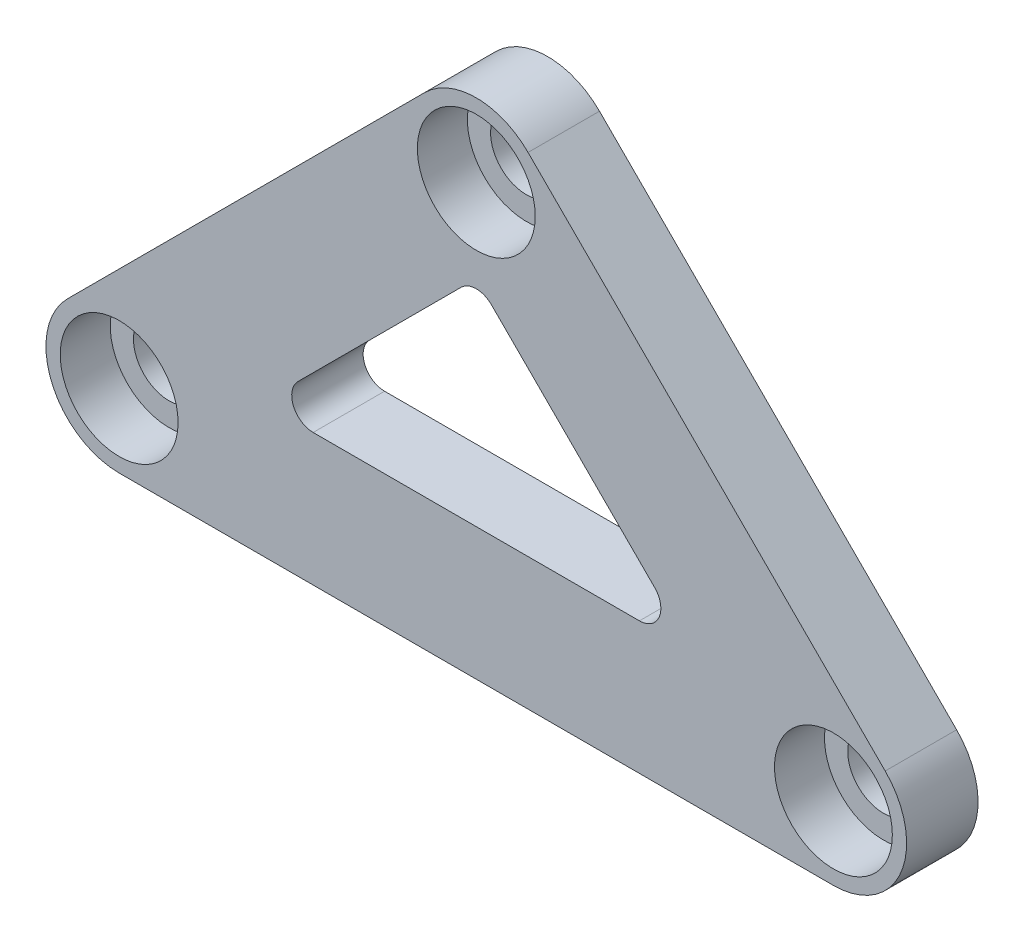
ISO-10303-21;
HEADER;
FILE_DESCRIPTION(('STEP AP214'),'2;1');
FILE_NAME('part.step','',(''),(''),'','','');
FILE_SCHEMA(('AUTOMOTIVE_DESIGN { 1 0 10303 214 1 1 1 1 }'));
ENDSEC;
DATA;
#1=APPLICATION_CONTEXT('core data for automotive mechanical design processes');
#2=APPLICATION_PROTOCOL_DEFINITION('international standard','automotive_design',2000,#1);
#3=PRODUCT_CONTEXT('',#1,'mechanical');
#4=PRODUCT('Part','Part','',(#3));
#5=PRODUCT_RELATED_PRODUCT_CATEGORY('part','',(#4));
#6=PRODUCT_DEFINITION_FORMATION('','',#4);
#7=PRODUCT_DEFINITION_CONTEXT('part definition',#1,'design');
#8=PRODUCT_DEFINITION('design','',#6,#7);
#9=PRODUCT_DEFINITION_SHAPE('','',#8);
#10=(LENGTH_UNIT() NAMED_UNIT(*) SI_UNIT(.MILLI.,.METRE.));
#11=(NAMED_UNIT(*) PLANE_ANGLE_UNIT() SI_UNIT($,.RADIAN.));
#12=(NAMED_UNIT(*) SI_UNIT($,.STERADIAN.) SOLID_ANGLE_UNIT());
#13=UNCERTAINTY_MEASURE_WITH_UNIT(LENGTH_MEASURE(1.E-05),#10,'distance_accuracy_value','');
#14=(GEOMETRIC_REPRESENTATION_CONTEXT(3) GLOBAL_UNCERTAINTY_ASSIGNED_CONTEXT((#13)) GLOBAL_UNIT_ASSIGNED_CONTEXT((#10,
#11,#12)) REPRESENTATION_CONTEXT('',''));
#15=CARTESIAN_POINT('',(0.,0.,0.));
#16=DIRECTION('',(0.,0.,1.));
#17=DIRECTION('',(1.,0.,0.));
#18=AXIS2_PLACEMENT_3D('',#15,#16,#17);
#19=CARTESIAN_POINT('',(0.,-10.25,10.));
#20=DIRECTION('',(0.,1.,0.));
#21=DIRECTION('',(-1.,0.,0.));
#22=AXIS2_PLACEMENT_3D('',#19,#20,#21);
#23=PLANE('',#22);
#24=DIRECTION('',(1.,0.,0.));
#25=VECTOR('',#24,1.);
#26=CARTESIAN_POINT('',(0.,-10.25,0.));
#27=LINE('',#26,#25);
#28=CARTESIAN_POINT('',(0.,-10.25,0.));
#29=VERTEX_POINT('',#28);
#30=CARTESIAN_POINT('',(100.,-10.25,0.));
#31=VERTEX_POINT('',#30);
#32=EDGE_CURVE('E217',#29,#31,#27,.T.);
#33=ORIENTED_EDGE('',*,*,#32,.T.);
#34=DIRECTION('',(0.,0.,-1.));
#35=VECTOR('',#34,1.);
#36=CARTESIAN_POINT('',(100.,-10.25,10.));
#37=LINE('',#36,#35);
#38=CARTESIAN_POINT('',(100.,-10.25,10.));
#39=VERTEX_POINT('',#38);
#40=EDGE_CURVE('E184',#39,#31,#37,.T.);
#41=ORIENTED_EDGE('',*,*,#40,.F.);
#42=DIRECTION('',(1.,0.,0.));
#43=VECTOR('',#42,1.);
#44=CARTESIAN_POINT('',(0.,-10.25,10.));
#45=LINE('',#44,#43);
#46=CARTESIAN_POINT('',(0.,-10.25,10.));
#47=VERTEX_POINT('',#46);
#48=EDGE_CURVE('E189',#47,#39,#45,.T.);
#49=ORIENTED_EDGE('',*,*,#48,.F.);
#50=DIRECTION('',(0.,0.,-1.));
#51=VECTOR('',#50,1.);
#52=CARTESIAN_POINT('',(0.,-10.25,10.));
#53=LINE('',#52,#51);
#54=EDGE_CURVE('E172',#47,#29,#53,.T.);
#55=ORIENTED_EDGE('',*,*,#54,.T.);
#56=EDGE_LOOP('',(#33,#41,#49,#55));
#57=FACE_BOUND('',#56,.T.);
#58=ADVANCED_FACE('F80',(#57),#23,.F.);
#59=CARTESIAN_POINT('',(100.,0.,10.));
#60=DIRECTION('',(0.,0.,-1.));
#61=DIRECTION('',(-1.,0.,0.));
#62=AXIS2_PLACEMENT_3D('',#59,#60,#61);
#63=CYLINDRICAL_SURFACE('',#62,10.25);
#64=CARTESIAN_POINT('',(100.,0.,0.));
#65=DIRECTION('',(0.,0.,1.));
#66=DIRECTION('',(1.,0.,0.));
#67=AXIS2_PLACEMENT_3D('',#64,#65,#66);
#68=CIRCLE('',#67,10.25);
#69=CARTESIAN_POINT('',(107.247844507162,7.24784450716217,0.));
#70=VERTEX_POINT('',#69);
#71=EDGE_CURVE('E208',#31,#70,#68,.T.);
#72=ORIENTED_EDGE('',*,*,#71,.T.);
#73=DIRECTION('',(0.,0.,-1.));
#74=VECTOR('',#73,1.);
#75=CARTESIAN_POINT('',(107.247844507162,7.24784450716217,10.));
#76=LINE('',#75,#74);
#77=CARTESIAN_POINT('',(107.247844507162,7.24784450716217,10.));
#78=VERTEX_POINT('',#77);
#79=EDGE_CURVE('E225',#78,#70,#76,.T.);
#80=ORIENTED_EDGE('',*,*,#79,.F.);
#81=CARTESIAN_POINT('',(100.,0.,10.));
#82=DIRECTION('',(0.,0.,1.));
#83=DIRECTION('',(1.,0.,0.));
#84=AXIS2_PLACEMENT_3D('',#81,#82,#83);
#85=CIRCLE('',#84,10.25);
#86=EDGE_CURVE('E200',#39,#78,#85,.T.);
#87=ORIENTED_EDGE('',*,*,#86,.F.);
#88=ORIENTED_EDGE('',*,*,#40,.T.);
#89=EDGE_LOOP('',(#72,#80,#87,#88));
#90=FACE_BOUND('',#89,.T.);
#91=ADVANCED_FACE('F440',(#90),#63,.T.);
#92=CARTESIAN_POINT('',(57.2478445071616,57.2478445071622,10.));
#93=DIRECTION('',(-0.707106781186544,-0.707106781186551,0.));
#94=DIRECTION('',(0.707106781186551,-0.707106781186544,0.));
#95=AXIS2_PLACEMENT_3D('',#92,#93,#94);
#96=PLANE('',#95);
#97=DIRECTION('',(-0.707106781186551,0.707106781186544,0.));
#98=VECTOR('',#97,1.);
#99=CARTESIAN_POINT('',(57.2478445071616,57.2478445071622,0.));
#100=LINE('',#99,#98);
#101=CARTESIAN_POINT('',(57.2478445071621,57.2478445071616,0.));
#102=VERTEX_POINT('',#101);
#103=EDGE_CURVE('E201',#70,#102,#100,.T.);
#104=ORIENTED_EDGE('',*,*,#103,.T.);
#105=DIRECTION('',(0.,0.,-1.));
#106=VECTOR('',#105,1.);
#107=CARTESIAN_POINT('',(57.2478445071621,57.2478445071616,10.));
#108=LINE('',#107,#106);
#109=CARTESIAN_POINT('',(57.2478445071621,57.2478445071616,10.));
#110=VERTEX_POINT('',#109);
#111=EDGE_CURVE('E216',#110,#102,#108,.T.);
#112=ORIENTED_EDGE('',*,*,#111,.F.);
#113=DIRECTION('',(-0.707106781186551,0.707106781186544,0.));
#114=VECTOR('',#113,1.);
#115=CARTESIAN_POINT('',(57.2478445071616,57.2478445071622,10.));
#116=LINE('',#115,#114);
#117=EDGE_CURVE('E205',#78,#110,#116,.T.);
#118=ORIENTED_EDGE('',*,*,#117,.F.);
#119=ORIENTED_EDGE('',*,*,#79,.T.);
#120=EDGE_LOOP('',(#104,#112,#118,#119));
#121=FACE_BOUND('',#120,.T.);
#122=ADVANCED_FACE('F364',(#121),#96,.F.);
#123=CARTESIAN_POINT('',(0.,0.,0.));
#124=DIRECTION('',(0.,0.,1.));
#125=DIRECTION('',(1.,0.,0.));
#126=AXIS2_PLACEMENT_3D('',#123,#124,#125);
#127=PLANE('',#126);
#128=CARTESIAN_POINT('',(0.,0.,0.));
#129=DIRECTION('',(0.,0.,1.));
#130=DIRECTION('',(1.,0.,0.));
#131=AXIS2_PLACEMENT_3D('',#128,#129,#130);
#132=CIRCLE('',#131,5.);
#133=CARTESIAN_POINT('',(5.,0.,0.));
#134=VERTEX_POINT('',#133);
#135=EDGE_CURVE('E302',#134,#134,#132,.T.);
#136=ORIENTED_EDGE('',*,*,#135,.T.);
#137=EDGE_LOOP('',(#136));
#138=FACE_BOUND('',#137,.T.);
#139=CARTESIAN_POINT('',(50.,49.9999999999995,0.));
#140=DIRECTION('',(0.,0.,1.));
#141=DIRECTION('',(1.,0.,0.));
#142=AXIS2_PLACEMENT_3D('',#139,#140,#141);
#143=CIRCLE('',#142,5.);
#144=CARTESIAN_POINT('',(55.,49.9999999999995,0.));
#145=VERTEX_POINT('',#144);
#146=EDGE_CURVE('E286',#145,#145,#143,.T.);
#147=ORIENTED_EDGE('',*,*,#146,.T.);
#148=EDGE_LOOP('',(#147));
#149=FACE_BOUND('',#148,.T.);
#150=CARTESIAN_POINT('',(100.,0.,0.));
#151=DIRECTION('',(0.,0.,1.));
#152=DIRECTION('',(1.,0.,0.));
#153=AXIS2_PLACEMENT_3D('',#150,#151,#152);
#154=CIRCLE('',#153,5.);
#155=CARTESIAN_POINT('',(105.,0.,0.));
#156=VERTEX_POINT('',#155);
#157=EDGE_CURVE('E290',#156,#156,#154,.T.);
#158=ORIENTED_EDGE('',*,*,#157,.T.);
#159=EDGE_LOOP('',(#158));
#160=FACE_BOUND('',#159,.T.);
#161=DIRECTION('',(1.,0.,0.));
#162=VECTOR('',#161,1.);
#163=CARTESIAN_POINT('',(0.,8.24999999999999,0.));
#164=LINE('',#163,#162);
#165=CARTESIAN_POINT('',(27.1599025766975,8.25,0.));
#166=VERTEX_POINT('',#165);
#167=CARTESIAN_POINT('',(72.8400974233025,8.25,0.));
#168=VERTEX_POINT('',#167);
#169=EDGE_CURVE('E317',#166,#168,#164,.T.);
#170=ORIENTED_EDGE('',*,*,#169,.T.);
#171=CARTESIAN_POINT('',(72.8400974233025,11.25,0.));
#172=DIRECTION('',(0.,0.,1.));
#173=DIRECTION('',(1.,0.,0.));
#174=AXIS2_PLACEMENT_3D('',#171,#172,#173);
#175=CIRCLE('',#174,3.);
#176=CARTESIAN_POINT('',(74.9614177668621,13.3713203435596,0.));
#177=VERTEX_POINT('',#176);
#178=EDGE_CURVE('E272',#168,#177,#175,.T.);
#179=ORIENTED_EDGE('',*,*,#178,.T.);
#180=DIRECTION('',(-0.707106781186551,0.707106781186544,0.));
#181=VECTOR('',#180,1.);
#182=CARTESIAN_POINT('',(44.1663690552105,44.1663690552109,0.));
#183=LINE('',#182,#181);
#184=CARTESIAN_POINT('',(52.1213203435596,36.2114177668619,0.));
#185=VERTEX_POINT('',#184);
#186=EDGE_CURVE('E321',#177,#185,#183,.T.);
#187=ORIENTED_EDGE('',*,*,#186,.T.);
#188=CARTESIAN_POINT('',(50.,34.0900974233022,0.));
#189=DIRECTION('',(0.,0.,1.));
#190=DIRECTION('',(1.,0.,0.));
#191=AXIS2_PLACEMENT_3D('',#188,#189,#190);
#192=CIRCLE('',#191,3.);
#193=CARTESIAN_POINT('',(47.8786796564404,36.2114177668619,0.));
#194=VERTEX_POINT('',#193);
#195=EDGE_CURVE('E12',#185,#194,#192,.T.);
#196=ORIENTED_EDGE('',*,*,#195,.T.);
#197=DIRECTION('',(-0.707106781186551,-0.707106781186544,0.));
#198=VECTOR('',#197,1.);
#199=CARTESIAN_POINT('',(5.83363094478899,-5.83363094478905,0.));
#200=LINE('',#199,#198);
#201=CARTESIAN_POINT('',(25.0385822331379,13.3713203435597,0.));
#202=VERTEX_POINT('',#201);
#203=EDGE_CURVE('E324',#194,#202,#200,.T.);
#204=ORIENTED_EDGE('',*,*,#203,.T.);
#205=CARTESIAN_POINT('',(27.1599025766975,11.25,0.));
#206=DIRECTION('',(0.,0.,1.));
#207=DIRECTION('',(1.,0.,0.));
#208=AXIS2_PLACEMENT_3D('',#205,#206,#207);
#209=CIRCLE('',#208,3.);
#210=EDGE_CURVE('E278',#202,#166,#209,.T.);
#211=ORIENTED_EDGE('',*,*,#210,.T.);
#212=EDGE_LOOP('',(#170,#179,#187,#196,#204,#211));
#213=FACE_BOUND('',#212,.T.);
#214=CARTESIAN_POINT('',(50.,49.9999999999995,0.));
#215=DIRECTION('',(0.,0.,1.));
#216=DIRECTION('',(1.,0.,0.));
#217=AXIS2_PLACEMENT_3D('',#214,#215,#216);
#218=CIRCLE('',#217,10.25);
#219=CARTESIAN_POINT('',(42.7521554928379,57.2478445071616,0.));
#220=VERTEX_POINT('',#219);
#221=EDGE_CURVE('E236',#102,#220,#218,.T.);
#222=ORIENTED_EDGE('',*,*,#221,.F.);
#223=ORIENTED_EDGE('',*,*,#103,.F.);
#224=ORIENTED_EDGE('',*,*,#71,.F.);
#225=ORIENTED_EDGE('',*,*,#32,.F.);
#226=CARTESIAN_POINT('',(0.,0.,0.));
#227=DIRECTION('',(0.,0.,1.));
#228=DIRECTION('',(1.,0.,0.));
#229=AXIS2_PLACEMENT_3D('',#226,#227,#228);
#230=CIRCLE('',#229,10.25);
#231=CARTESIAN_POINT('',(-7.24784450716208,7.24784450716215,0.));
#232=VERTEX_POINT('',#231);
#233=EDGE_CURVE('E178',#232,#29,#230,.T.);
#234=ORIENTED_EDGE('',*,*,#233,.F.);
#235=DIRECTION('',(-0.707106781186551,-0.707106781186544,0.));
#236=VECTOR('',#235,1.);
#237=CARTESIAN_POINT('',(42.7521554928379,57.2478445071616,0.));
#238=LINE('',#237,#236);
#239=EDGE_CURVE('E239',#220,#232,#238,.T.);
#240=ORIENTED_EDGE('',*,*,#239,.F.);
#241=EDGE_LOOP('',(#222,#223,#224,#225,#234,#240));
#242=FACE_BOUND('',#241,.T.);
#243=ADVANCED_FACE('F354',(#138,#149,#160,#213,#242),#127,.F.);
#244=CARTESIAN_POINT('',(0.,0.,10.));
#245=DIRECTION('',(0.,0.,1.));
#246=DIRECTION('',(1.,0.,0.));
#247=AXIS2_PLACEMENT_3D('',#244,#245,#246);
#248=PLANE('',#247);
#249=DIRECTION('',(-0.707106781186551,-0.707106781186544,0.));
#250=VECTOR('',#249,1.);
#251=CARTESIAN_POINT('',(50.,38.3327381104215,10.));
#252=LINE('',#251,#250);
#253=CARTESIAN_POINT('',(47.8786796564404,36.2114177668619,10.));
#254=VERTEX_POINT('',#253);
#255=CARTESIAN_POINT('',(25.0385822331379,13.3713203435597,10.));
#256=VERTEX_POINT('',#255);
#257=EDGE_CURVE('E306',#254,#256,#252,.T.);
#258=ORIENTED_EDGE('',*,*,#257,.F.);
#259=CARTESIAN_POINT('',(50.,34.0900974233022,10.));
#260=DIRECTION('',(0.,0.,1.));
#261=DIRECTION('',(1.,0.,0.));
#262=AXIS2_PLACEMENT_3D('',#259,#260,#261);
#263=CIRCLE('',#262,3.);
#264=CARTESIAN_POINT('',(52.1213203435596,36.2114177668619,10.));
#265=VERTEX_POINT('',#264);
#266=EDGE_CURVE('E90',#254,#265,#263,.F.);
#267=ORIENTED_EDGE('',*,*,#266,.T.);
#268=DIRECTION('',(-0.707106781186551,0.707106781186544,0.));
#269=VECTOR('',#268,1.);
#270=CARTESIAN_POINT('',(80.0827381104218,8.25,10.));
#271=LINE('',#270,#269);
#272=CARTESIAN_POINT('',(74.9614177668621,13.3713203435597,10.));
#273=VERTEX_POINT('',#272);
#274=EDGE_CURVE('E313',#273,#265,#271,.T.);
#275=ORIENTED_EDGE('',*,*,#274,.F.);
#276=CARTESIAN_POINT('',(72.8400974233025,11.25,10.));
#277=DIRECTION('',(0.,0.,1.));
#278=DIRECTION('',(1.,0.,0.));
#279=AXIS2_PLACEMENT_3D('',#276,#277,#278);
#280=CIRCLE('',#279,3.);
#281=CARTESIAN_POINT('',(72.8400974233025,8.25,10.));
#282=VERTEX_POINT('',#281);
#283=EDGE_CURVE('E269',#273,#282,#280,.F.);
#284=ORIENTED_EDGE('',*,*,#283,.T.);
#285=DIRECTION('',(1.,0.,0.));
#286=VECTOR('',#285,1.);
#287=CARTESIAN_POINT('',(19.9172618895782,8.25,10.));
#288=LINE('',#287,#286);
#289=CARTESIAN_POINT('',(27.1599025766975,8.25,10.));
#290=VERTEX_POINT('',#289);
#291=EDGE_CURVE('E309',#290,#282,#288,.T.);
#292=ORIENTED_EDGE('',*,*,#291,.F.);
#293=CARTESIAN_POINT('',(27.1599025766975,11.25,10.));
#294=DIRECTION('',(0.,0.,1.));
#295=DIRECTION('',(1.,0.,0.));
#296=AXIS2_PLACEMENT_3D('',#293,#294,#295);
#297=CIRCLE('',#296,3.);
#298=EDGE_CURVE('E275',#290,#256,#297,.F.);
#299=ORIENTED_EDGE('',*,*,#298,.T.);
#300=EDGE_LOOP('',(#258,#267,#275,#284,#292,#299));
#301=FACE_BOUND('',#300,.T.);
#302=CARTESIAN_POINT('',(50.,49.9999999999995,10.));
#303=DIRECTION('',(0.,0.,1.));
#304=DIRECTION('',(1.,0.,0.));
#305=AXIS2_PLACEMENT_3D('',#302,#303,#304);
#306=CIRCLE('',#305,8.25);
#307=CARTESIAN_POINT('',(58.25,49.9999999999995,10.));
#308=VERTEX_POINT('',#307);
#309=EDGE_CURVE('E330',#308,#308,#306,.T.);
#310=ORIENTED_EDGE('',*,*,#309,.F.);
#311=EDGE_LOOP('',(#310));
#312=FACE_BOUND('',#311,.T.);
#313=CARTESIAN_POINT('',(100.,0.,10.));
#314=DIRECTION('',(0.,0.,1.));
#315=DIRECTION('',(1.,0.,0.));
#316=AXIS2_PLACEMENT_3D('',#313,#314,#315);
#317=CIRCLE('',#316,8.25000000000001);
#318=CARTESIAN_POINT('',(108.25,0.,10.));
#319=VERTEX_POINT('',#318);
#320=EDGE_CURVE('E338',#319,#319,#317,.T.);
#321=ORIENTED_EDGE('',*,*,#320,.F.);
#322=EDGE_LOOP('',(#321));
#323=FACE_BOUND('',#322,.T.);
#324=CARTESIAN_POINT('',(0.,0.,10.));
#325=DIRECTION('',(0.,0.,1.));
#326=DIRECTION('',(1.,0.,0.));
#327=AXIS2_PLACEMENT_3D('',#324,#325,#326);
#328=CIRCLE('',#327,8.25);
#329=CARTESIAN_POINT('',(8.25,0.,10.));
#330=VERTEX_POINT('',#329);
#331=EDGE_CURVE('E211',#330,#330,#328,.T.);
#332=ORIENTED_EDGE('',*,*,#331,.F.);
#333=EDGE_LOOP('',(#332));
#334=FACE_BOUND('',#333,.T.);
#335=ORIENTED_EDGE('',*,*,#117,.T.);
#336=CARTESIAN_POINT('',(50.,49.9999999999995,10.));
#337=DIRECTION('',(0.,0.,1.));
#338=DIRECTION('',(1.,0.,0.));
#339=AXIS2_PLACEMENT_3D('',#336,#337,#338);
#340=CIRCLE('',#339,10.25);
#341=CARTESIAN_POINT('',(42.7521554928379,57.2478445071616,10.));
#342=VERTEX_POINT('',#341);
#343=EDGE_CURVE('E231',#110,#342,#340,.T.);
#344=ORIENTED_EDGE('',*,*,#343,.T.);
#345=DIRECTION('',(-0.707106781186551,-0.707106781186544,0.));
#346=VECTOR('',#345,1.);
#347=CARTESIAN_POINT('',(42.7521554928379,57.2478445071616,10.));
#348=LINE('',#347,#346);
#349=CARTESIAN_POINT('',(-7.24784450716208,7.24784450716215,10.));
#350=VERTEX_POINT('',#349);
#351=EDGE_CURVE('E192',#342,#350,#348,.T.);
#352=ORIENTED_EDGE('',*,*,#351,.T.);
#353=CARTESIAN_POINT('',(0.,0.,10.));
#354=DIRECTION('',(0.,0.,1.));
#355=DIRECTION('',(1.,0.,0.));
#356=AXIS2_PLACEMENT_3D('',#353,#354,#355);
#357=CIRCLE('',#356,10.25);
#358=EDGE_CURVE('E176',#350,#47,#357,.T.);
#359=ORIENTED_EDGE('',*,*,#358,.T.);
#360=ORIENTED_EDGE('',*,*,#48,.T.);
#361=ORIENTED_EDGE('',*,*,#86,.T.);
#362=EDGE_LOOP('',(#335,#344,#352,#359,#360,#361));
#363=FACE_BOUND('',#362,.T.);
#364=ADVANCED_FACE('F188',(#301,#312,#323,#334,#363),#248,.T.);
#365=CARTESIAN_POINT('',(50.,49.9999999999995,10.));
#366=DIRECTION('',(0.,0.,-1.));
#367=DIRECTION('',(-1.,0.,0.));
#368=AXIS2_PLACEMENT_3D('',#365,#366,#367);
#369=CYLINDRICAL_SURFACE('',#368,10.25);
#370=ORIENTED_EDGE('',*,*,#111,.T.);
#371=ORIENTED_EDGE('',*,*,#221,.T.);
#372=DIRECTION('',(0.,0.,-1.));
#373=VECTOR('',#372,1.);
#374=CARTESIAN_POINT('',(42.7521554928379,57.2478445071616,10.));
#375=LINE('',#374,#373);
#376=EDGE_CURVE('E220',#342,#220,#375,.T.);
#377=ORIENTED_EDGE('',*,*,#376,.F.);
#378=ORIENTED_EDGE('',*,*,#343,.F.);
#379=EDGE_LOOP('',(#370,#371,#377,#378));
#380=FACE_BOUND('',#379,.T.);
#381=ADVANCED_FACE('F353',(#380),#369,.T.);
#382=CARTESIAN_POINT('',(42.7521554928379,57.2478445071616,10.));
#383=DIRECTION('',(0.707106781186544,-0.707106781186551,0.));
#384=DIRECTION('',(0.707106781186551,0.707106781186544,0.));
#385=AXIS2_PLACEMENT_3D('',#382,#383,#384);
#386=PLANE('',#385);
#387=ORIENTED_EDGE('',*,*,#239,.T.);
#388=DIRECTION('',(0.,0.,-1.));
#389=VECTOR('',#388,1.);
#390=CARTESIAN_POINT('',(-7.24784450716208,7.24784450716215,10.));
#391=LINE('',#390,#389);
#392=EDGE_CURVE('E195',#350,#232,#391,.T.);
#393=ORIENTED_EDGE('',*,*,#392,.F.);
#394=ORIENTED_EDGE('',*,*,#351,.F.);
#395=ORIENTED_EDGE('',*,*,#376,.T.);
#396=EDGE_LOOP('',(#387,#393,#394,#395));
#397=FACE_BOUND('',#396,.T.);
#398=ADVANCED_FACE('F361',(#397),#386,.F.);
#399=CARTESIAN_POINT('',(0.,0.,10.));
#400=DIRECTION('',(0.,0.,-1.));
#401=DIRECTION('',(-1.,0.,0.));
#402=AXIS2_PLACEMENT_3D('',#399,#400,#401);
#403=CYLINDRICAL_SURFACE('',#402,10.25);
#404=ORIENTED_EDGE('',*,*,#233,.T.);
#405=ORIENTED_EDGE('',*,*,#54,.F.);
#406=ORIENTED_EDGE('',*,*,#358,.F.);
#407=ORIENTED_EDGE('',*,*,#392,.T.);
#408=EDGE_LOOP('',(#404,#405,#406,#407));
#409=FACE_BOUND('',#408,.T.);
#410=ADVANCED_FACE('F174',(#409),#403,.T.);
#411=CARTESIAN_POINT('',(0.,0.,3.));
#412=DIRECTION('',(0.,0.,1.));
#413=DIRECTION('',(1.,0.,0.));
#414=AXIS2_PLACEMENT_3D('',#411,#412,#413);
#415=CYLINDRICAL_SURFACE('',#414,8.25);
#416=CARTESIAN_POINT('',(0.,0.,3.));
#417=DIRECTION('',(0.,0.,1.));
#418=DIRECTION('',(1.,0.,0.));
#419=AXIS2_PLACEMENT_3D('',#416,#417,#418);
#420=CIRCLE('',#419,8.25);
#421=CARTESIAN_POINT('',(8.25,0.,3.));
#422=VERTEX_POINT('',#421);
#423=EDGE_CURVE('E341',#422,#422,#420,.T.);
#424=ORIENTED_EDGE('',*,*,#423,.F.);
#425=EDGE_LOOP('',(#424));
#426=FACE_BOUND('',#425,.T.);
#427=ORIENTED_EDGE('',*,*,#331,.T.);
#428=EDGE_LOOP('',(#427));
#429=FACE_BOUND('',#428,.T.);
#430=ADVANCED_FACE('F350',(#426,#429),#415,.F.);
#431=CARTESIAN_POINT('',(0.,0.,3.));
#432=DIRECTION('',(0.,0.,1.));
#433=DIRECTION('',(1.,0.,0.));
#434=AXIS2_PLACEMENT_3D('',#431,#432,#433);
#435=PLANE('',#434);
#436=CARTESIAN_POINT('',(0.,0.,3.));
#437=DIRECTION('',(0.,0.,1.));
#438=DIRECTION('',(1.,0.,0.));
#439=AXIS2_PLACEMENT_3D('',#436,#437,#438);
#440=CIRCLE('',#439,5.);
#441=CARTESIAN_POINT('',(5.,0.,3.));
#442=VERTEX_POINT('',#441);
#443=EDGE_CURVE('E84',#442,#442,#440,.T.);
#444=ORIENTED_EDGE('',*,*,#443,.F.);
#445=EDGE_LOOP('',(#444));
#446=FACE_BOUND('',#445,.T.);
#447=ORIENTED_EDGE('',*,*,#423,.T.);
#448=EDGE_LOOP('',(#447));
#449=FACE_BOUND('',#448,.T.);
#450=ADVANCED_FACE('F371',(#446,#449),#435,.T.);
#451=CARTESIAN_POINT('',(100.,0.,3.));
#452=DIRECTION('',(0.,0.,1.));
#453=DIRECTION('',(1.,0.,0.));
#454=AXIS2_PLACEMENT_3D('',#451,#452,#453);
#455=CYLINDRICAL_SURFACE('',#454,8.25000000000001);
#456=CARTESIAN_POINT('',(100.,0.,3.));
#457=DIRECTION('',(0.,0.,1.));
#458=DIRECTION('',(1.,0.,0.));
#459=AXIS2_PLACEMENT_3D('',#456,#457,#458);
#460=CIRCLE('',#459,8.25000000000001);
#461=CARTESIAN_POINT('',(108.25,0.,3.));
#462=VERTEX_POINT('',#461);
#463=EDGE_CURVE('E334',#462,#462,#460,.T.);
#464=ORIENTED_EDGE('',*,*,#463,.F.);
#465=EDGE_LOOP('',(#464));
#466=FACE_BOUND('',#465,.T.);
#467=ORIENTED_EDGE('',*,*,#320,.T.);
#468=EDGE_LOOP('',(#467));
#469=FACE_BOUND('',#468,.T.);
#470=ADVANCED_FACE('F377',(#466,#469),#455,.F.);
#471=CARTESIAN_POINT('',(100.,0.,3.));
#472=DIRECTION('',(0.,0.,1.));
#473=DIRECTION('',(1.,0.,0.));
#474=AXIS2_PLACEMENT_3D('',#471,#472,#473);
#475=PLANE('',#474);
#476=CARTESIAN_POINT('',(100.,0.,3.));
#477=DIRECTION('',(0.,0.,1.));
#478=DIRECTION('',(1.,0.,0.));
#479=AXIS2_PLACEMENT_3D('',#476,#477,#478);
#480=CIRCLE('',#479,5.);
#481=CARTESIAN_POINT('',(105.,0.,3.));
#482=VERTEX_POINT('',#481);
#483=EDGE_CURVE('E287',#482,#482,#480,.T.);
#484=ORIENTED_EDGE('',*,*,#483,.F.);
#485=EDGE_LOOP('',(#484));
#486=FACE_BOUND('',#485,.T.);
#487=ORIENTED_EDGE('',*,*,#463,.T.);
#488=EDGE_LOOP('',(#487));
#489=FACE_BOUND('',#488,.T.);
#490=ADVANCED_FACE('F384',(#486,#489),#475,.T.);
#491=CARTESIAN_POINT('',(50.,49.9999999999995,3.));
#492=DIRECTION('',(0.,0.,1.));
#493=DIRECTION('',(1.,0.,0.));
#494=AXIS2_PLACEMENT_3D('',#491,#492,#493);
#495=CYLINDRICAL_SURFACE('',#494,8.25);
#496=CARTESIAN_POINT('',(50.,49.9999999999995,3.));
#497=DIRECTION('',(0.,0.,1.));
#498=DIRECTION('',(1.,0.,0.));
#499=AXIS2_PLACEMENT_3D('',#496,#497,#498);
#500=CIRCLE('',#499,8.25);
#501=CARTESIAN_POINT('',(58.25,49.9999999999995,3.));
#502=VERTEX_POINT('',#501);
#503=EDGE_CURVE('E240',#502,#502,#500,.T.);
#504=ORIENTED_EDGE('',*,*,#503,.F.);
#505=EDGE_LOOP('',(#504));
#506=FACE_BOUND('',#505,.T.);
#507=ORIENTED_EDGE('',*,*,#309,.T.);
#508=EDGE_LOOP('',(#507));
#509=FACE_BOUND('',#508,.T.);
#510=ADVANCED_FACE('F388',(#506,#509),#495,.F.);
#511=CARTESIAN_POINT('',(50.,49.9999999999995,3.));
#512=DIRECTION('',(0.,0.,1.));
#513=DIRECTION('',(1.,0.,0.));
#514=AXIS2_PLACEMENT_3D('',#511,#512,#513);
#515=PLANE('',#514);
#516=CARTESIAN_POINT('',(50.,49.9999999999995,3.));
#517=DIRECTION('',(0.,0.,1.));
#518=DIRECTION('',(1.,0.,0.));
#519=AXIS2_PLACEMENT_3D('',#516,#517,#518);
#520=CIRCLE('',#519,5.);
#521=CARTESIAN_POINT('',(55.,49.9999999999995,3.));
#522=VERTEX_POINT('',#521);
#523=EDGE_CURVE('E283',#522,#522,#520,.T.);
#524=ORIENTED_EDGE('',*,*,#523,.F.);
#525=EDGE_LOOP('',(#524));
#526=FACE_BOUND('',#525,.T.);
#527=ORIENTED_EDGE('',*,*,#503,.T.);
#528=EDGE_LOOP('',(#527));
#529=FACE_BOUND('',#528,.T.);
#530=ADVANCED_FACE('F392',(#526,#529),#515,.T.);
#531=CARTESIAN_POINT('',(50.,38.3327381104215,-6.));
#532=DIRECTION('',(-0.707106781186544,0.707106781186551,0.));
#533=DIRECTION('',(-0.707106781186551,-0.707106781186544,0.));
#534=AXIS2_PLACEMENT_3D('',#531,#532,#533);
#535=PLANE('',#534);
#536=ORIENTED_EDGE('',*,*,#257,.T.);
#537=DIRECTION('',(0.,0.,1.));
#538=VECTOR('',#537,1.);
#539=CARTESIAN_POINT('',(25.0385822331379,13.3713203435597,0.));
#540=LINE('',#539,#538);
#541=EDGE_CURVE('E98',#256,#202,#540,.F.);
#542=ORIENTED_EDGE('',*,*,#541,.T.);
#543=ORIENTED_EDGE('',*,*,#203,.F.);
#544=DIRECTION('',(0.,0.,1.));
#545=VECTOR('',#544,1.);
#546=CARTESIAN_POINT('',(47.8786796564404,36.2114177668619,10.));
#547=LINE('',#546,#545);
#548=EDGE_CURVE('E263',#194,#254,#547,.T.);
#549=ORIENTED_EDGE('',*,*,#548,.T.);
#550=EDGE_LOOP('',(#536,#542,#543,#549));
#551=FACE_BOUND('',#550,.T.);
#552=ADVANCED_FACE('F396',(#551),#535,.F.);
#553=CARTESIAN_POINT('',(80.0827381104218,8.25,-6.));
#554=DIRECTION('',(0.707106781186544,0.707106781186551,0.));
#555=DIRECTION('',(-0.707106781186551,0.707106781186544,0.));
#556=AXIS2_PLACEMENT_3D('',#553,#554,#555);
#557=PLANE('',#556);
#558=ORIENTED_EDGE('',*,*,#186,.F.);
#559=DIRECTION('',(0.,0.,1.));
#560=VECTOR('',#559,1.);
#561=CARTESIAN_POINT('',(74.9614177668621,13.3713203435597,10.));
#562=LINE('',#561,#560);
#563=EDGE_CURVE('E252',#177,#273,#562,.T.);
#564=ORIENTED_EDGE('',*,*,#563,.T.);
#565=ORIENTED_EDGE('',*,*,#274,.T.);
#566=DIRECTION('',(0.,0.,1.));
#567=VECTOR('',#566,1.);
#568=CARTESIAN_POINT('',(52.1213203435596,36.2114177668619,0.));
#569=LINE('',#568,#567);
#570=EDGE_CURVE('E183',#265,#185,#569,.F.);
#571=ORIENTED_EDGE('',*,*,#570,.T.);
#572=EDGE_LOOP('',(#558,#564,#565,#571));
#573=FACE_BOUND('',#572,.T.);
#574=ADVANCED_FACE('F400',(#573),#557,.F.);
#575=CARTESIAN_POINT('',(19.9172618895782,8.25,-6.));
#576=DIRECTION('',(0.,-1.,0.));
#577=DIRECTION('',(1.,0.,0.));
#578=AXIS2_PLACEMENT_3D('',#575,#576,#577);
#579=PLANE('',#578);
#580=ORIENTED_EDGE('',*,*,#291,.T.);
#581=DIRECTION('',(0.,0.,1.));
#582=VECTOR('',#581,1.);
#583=CARTESIAN_POINT('',(72.8400974233025,8.25,0.));
#584=LINE('',#583,#582);
#585=EDGE_CURVE('E260',#282,#168,#584,.F.);
#586=ORIENTED_EDGE('',*,*,#585,.T.);
#587=ORIENTED_EDGE('',*,*,#169,.F.);
#588=DIRECTION('',(0.,0.,1.));
#589=VECTOR('',#588,1.);
#590=CARTESIAN_POINT('',(27.1599025766975,8.25,10.));
#591=LINE('',#590,#589);
#592=EDGE_CURVE('E256',#166,#290,#591,.T.);
#593=ORIENTED_EDGE('',*,*,#592,.T.);
#594=EDGE_LOOP('',(#580,#586,#587,#593));
#595=FACE_BOUND('',#594,.T.);
#596=ADVANCED_FACE('F401',(#595),#579,.F.);
#597=CARTESIAN_POINT('',(72.8400974233025,11.25,-6.));
#598=DIRECTION('',(0.,0.,-1.));
#599=DIRECTION('',(-1.,0.,0.));
#600=AXIS2_PLACEMENT_3D('',#597,#598,#599);
#601=CYLINDRICAL_SURFACE('',#600,3.);
#602=ORIENTED_EDGE('',*,*,#178,.F.);
#603=ORIENTED_EDGE('',*,*,#585,.F.);
#604=ORIENTED_EDGE('',*,*,#283,.F.);
#605=ORIENTED_EDGE('',*,*,#563,.F.);
#606=EDGE_LOOP('',(#602,#603,#604,#605));
#607=FACE_BOUND('',#606,.T.);
#608=ADVANCED_FACE('F404',(#607),#601,.F.);
#609=CARTESIAN_POINT('',(27.1599025766975,11.25,-6.));
#610=DIRECTION('',(0.,0.,-1.));
#611=DIRECTION('',(-1.,0.,0.));
#612=AXIS2_PLACEMENT_3D('',#609,#610,#611);
#613=CYLINDRICAL_SURFACE('',#612,3.);
#614=ORIENTED_EDGE('',*,*,#210,.F.);
#615=ORIENTED_EDGE('',*,*,#541,.F.);
#616=ORIENTED_EDGE('',*,*,#298,.F.);
#617=ORIENTED_EDGE('',*,*,#592,.F.);
#618=EDGE_LOOP('',(#614,#615,#616,#617));
#619=FACE_BOUND('',#618,.T.);
#620=ADVANCED_FACE('F449',(#619),#613,.F.);
#621=CARTESIAN_POINT('',(50.,34.0900974233022,-6.));
#622=DIRECTION('',(0.,0.,-1.));
#623=DIRECTION('',(-1.,0.,0.));
#624=AXIS2_PLACEMENT_3D('',#621,#622,#623);
#625=CYLINDRICAL_SURFACE('',#624,3.);
#626=ORIENTED_EDGE('',*,*,#195,.F.);
#627=ORIENTED_EDGE('',*,*,#570,.F.);
#628=ORIENTED_EDGE('',*,*,#266,.F.);
#629=ORIENTED_EDGE('',*,*,#548,.F.);
#630=EDGE_LOOP('',(#626,#627,#628,#629));
#631=FACE_BOUND('',#630,.T.);
#632=ADVANCED_FACE('F82',(#631),#625,.F.);
#633=CARTESIAN_POINT('',(50.,49.9999999999995,-6.));
#634=DIRECTION('',(0.,0.,1.));
#635=DIRECTION('',(1.,0.,0.));
#636=AXIS2_PLACEMENT_3D('',#633,#634,#635);
#637=CYLINDRICAL_SURFACE('',#636,5.);
#638=ORIENTED_EDGE('',*,*,#523,.T.);
#639=EDGE_LOOP('',(#638));
#640=FACE_BOUND('',#639,.T.);
#641=ORIENTED_EDGE('',*,*,#146,.F.);
#642=EDGE_LOOP('',(#641));
#643=FACE_BOUND('',#642,.T.);
#644=ADVANCED_FACE('F413',(#640,#643),#637,.F.);
#645=CARTESIAN_POINT('',(100.,0.,-6.));
#646=DIRECTION('',(0.,0.,1.));
#647=DIRECTION('',(1.,0.,0.));
#648=AXIS2_PLACEMENT_3D('',#645,#646,#647);
#649=CYLINDRICAL_SURFACE('',#648,5.);
#650=ORIENTED_EDGE('',*,*,#483,.T.);
#651=EDGE_LOOP('',(#650));
#652=FACE_BOUND('',#651,.T.);
#653=ORIENTED_EDGE('',*,*,#157,.F.);
#654=EDGE_LOOP('',(#653));
#655=FACE_BOUND('',#654,.T.);
#656=ADVANCED_FACE('F409',(#652,#655),#649,.F.);
#657=CARTESIAN_POINT('',(0.,0.,-6.));
#658=DIRECTION('',(0.,0.,1.));
#659=DIRECTION('',(1.,0.,0.));
#660=AXIS2_PLACEMENT_3D('',#657,#658,#659);
#661=CYLINDRICAL_SURFACE('',#660,5.);
#662=ORIENTED_EDGE('',*,*,#443,.T.);
#663=EDGE_LOOP('',(#662));
#664=FACE_BOUND('',#663,.T.);
#665=ORIENTED_EDGE('',*,*,#135,.F.);
#666=EDGE_LOOP('',(#665));
#667=FACE_BOUND('',#666,.T.);
#668=ADVANCED_FACE('F412',(#664,#667),#661,.F.);
#669=CLOSED_SHELL('',(#58,#91,#122,#243,#364,#381,#398,#410,#430,#450,#470,#490,#510,#530,#552,
#574,#596,#608,#620,#632,#644,#656,#668));
#670=MANIFOLD_SOLID_BREP('B2',#669);
#671=ADVANCED_BREP_SHAPE_REPRESENTATION('',(#18,#670),#14);
#672=SHAPE_DEFINITION_REPRESENTATION(#9,#671);
ENDSEC;
END-ISO-10303-21;
